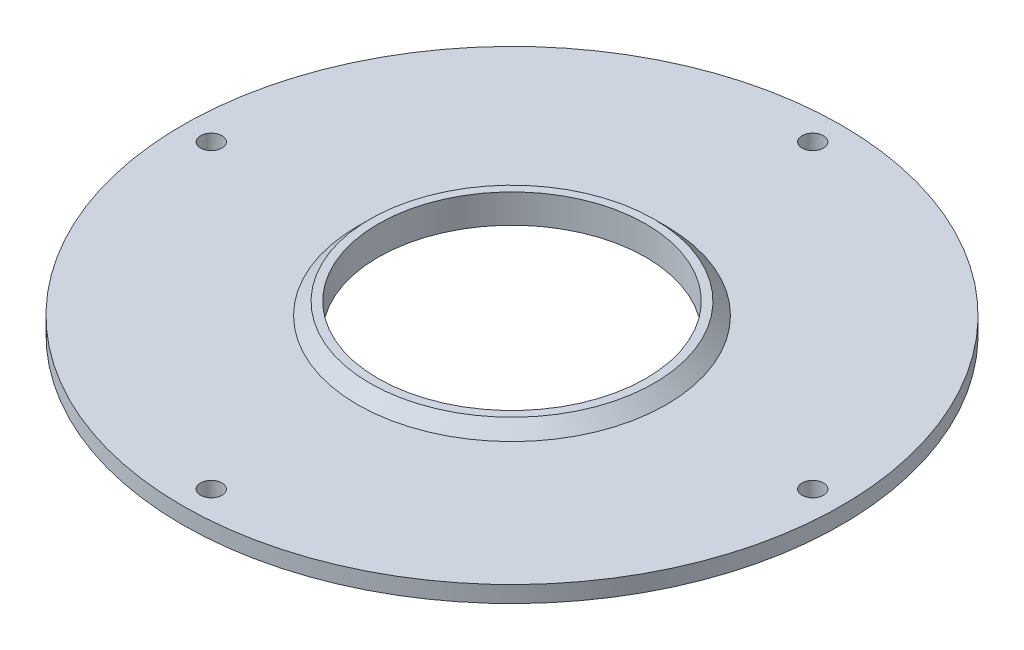
ISO-10303-21;
HEADER;
FILE_DESCRIPTION(('STEP AP214'),'2;1');
FILE_NAME('part.step','',(''),(''),'','','');
FILE_SCHEMA(('AUTOMOTIVE_DESIGN { 1 0 10303 214 1 1 1 1 }'));
ENDSEC;
DATA;
#1=APPLICATION_CONTEXT('core data for automotive mechanical design processes');
#2=APPLICATION_PROTOCOL_DEFINITION('international standard','automotive_design',2000,#1);
#3=PRODUCT_CONTEXT('',#1,'mechanical');
#4=PRODUCT('Part','Part','',(#3));
#5=PRODUCT_RELATED_PRODUCT_CATEGORY('part','',(#4));
#6=PRODUCT_DEFINITION_FORMATION('','',#4);
#7=PRODUCT_DEFINITION_CONTEXT('part definition',#1,'design');
#8=PRODUCT_DEFINITION('design','',#6,#7);
#9=PRODUCT_DEFINITION_SHAPE('','',#8);
#10=(LENGTH_UNIT() NAMED_UNIT(*) SI_UNIT(.MILLI.,.METRE.));
#11=(NAMED_UNIT(*) PLANE_ANGLE_UNIT() SI_UNIT($,.RADIAN.));
#12=(NAMED_UNIT(*) SI_UNIT($,.STERADIAN.) SOLID_ANGLE_UNIT());
#13=UNCERTAINTY_MEASURE_WITH_UNIT(LENGTH_MEASURE(1.E-05),#10,'distance_accuracy_value','');
#14=(GEOMETRIC_REPRESENTATION_CONTEXT(3) GLOBAL_UNCERTAINTY_ASSIGNED_CONTEXT((#13)) GLOBAL_UNIT_ASSIGNED_CONTEXT((#10,
#11,#12)) REPRESENTATION_CONTEXT('',''));
#15=CARTESIAN_POINT('',(0.,0.,0.));
#16=DIRECTION('',(0.,0.,1.));
#17=DIRECTION('',(1.,0.,0.));
#18=AXIS2_PLACEMENT_3D('',#15,#16,#17);
#19=CARTESIAN_POINT('',(0.,4.,0.));
#20=DIRECTION('',(0.,1.,0.));
#21=DIRECTION('',(0.,0.,1.));
#22=AXIS2_PLACEMENT_3D('',#19,#20,#21);
#23=PLANE('',#22);
#24=CARTESIAN_POINT('',(0.,4.,0.));
#25=DIRECTION('',(0.,1.,0.));
#26=DIRECTION('',(0.,0.,1.));
#27=AXIS2_PLACEMENT_3D('',#24,#25,#26);
#28=CIRCLE('',#27,37.5);
#29=CARTESIAN_POINT('',(0.,4.,37.5));
#30=VERTEX_POINT('',#29);
#31=EDGE_CURVE('E10',#30,#30,#28,.F.);
#32=ORIENTED_EDGE('',*,*,#31,.T.);
#33=EDGE_LOOP('',(#32));
#34=FACE_BOUND('',#33,.T.);
#35=CARTESIAN_POINT('',(0.,4.,0.));
#36=DIRECTION('',(0.,1.,0.));
#37=DIRECTION('',(0.,0.,1.));
#38=AXIS2_PLACEMENT_3D('',#35,#36,#37);
#39=CIRCLE('',#38,80.);
#40=CARTESIAN_POINT('',(0.,4.,80.));
#41=VERTEX_POINT('',#40);
#42=EDGE_CURVE('E52',#41,#41,#39,.T.);
#43=ORIENTED_EDGE('',*,*,#42,.T.);
#44=EDGE_LOOP('',(#43));
#45=FACE_BOUND('',#44,.T.);
#46=CARTESIAN_POINT('',(-73.,4.,-7.64634413206646E-13));
#47=DIRECTION('',(0.,1.,0.));
#48=DIRECTION('',(0.,0.,1.));
#49=AXIS2_PLACEMENT_3D('',#46,#47,#48);
#50=CIRCLE('',#49,2.60000000000001);
#51=CARTESIAN_POINT('',(-73.,4.,2.59999999999924));
#52=VERTEX_POINT('',#51);
#53=EDGE_CURVE('E73',#52,#52,#50,.T.);
#54=ORIENTED_EDGE('',*,*,#53,.F.);
#55=EDGE_LOOP('',(#54));
#56=FACE_BOUND('',#55,.T.);
#57=CARTESIAN_POINT('',(-5.09756275471097E-13,4.,73.));
#58=DIRECTION('',(0.,1.,0.));
#59=DIRECTION('',(0.,0.,1.));
#60=AXIS2_PLACEMENT_3D('',#57,#58,#59);
#61=CIRCLE('',#60,2.60000000000001);
#62=CARTESIAN_POINT('',(-5.09756275471097E-13,4.,75.6));
#63=VERTEX_POINT('',#62);
#64=EDGE_CURVE('E82',#63,#63,#61,.T.);
#65=ORIENTED_EDGE('',*,*,#64,.F.);
#66=EDGE_LOOP('',(#65));
#67=FACE_BOUND('',#66,.T.);
#68=CARTESIAN_POINT('',(73.,4.,2.54878137735549E-13));
#69=DIRECTION('',(0.,1.,0.));
#70=DIRECTION('',(0.,0.,1.));
#71=AXIS2_PLACEMENT_3D('',#68,#69,#70);
#72=CIRCLE('',#71,2.60000000000001);
#73=CARTESIAN_POINT('',(73.,4.,2.60000000000026));
#74=VERTEX_POINT('',#73);
#75=EDGE_CURVE('E90',#74,#74,#72,.T.);
#76=ORIENTED_EDGE('',*,*,#75,.F.);
#77=EDGE_LOOP('',(#76));
#78=FACE_BOUND('',#77,.T.);
#79=CARTESIAN_POINT('',(0.,4.,-73.));
#80=DIRECTION('',(0.,1.,0.));
#81=DIRECTION('',(0.,0.,1.));
#82=AXIS2_PLACEMENT_3D('',#79,#80,#81);
#83=CIRCLE('',#82,2.60000000000001);
#84=CARTESIAN_POINT('',(0.,4.,-70.4));
#85=VERTEX_POINT('',#84);
#86=EDGE_CURVE('E94',#85,#85,#83,.T.);
#87=ORIENTED_EDGE('',*,*,#86,.F.);
#88=EDGE_LOOP('',(#87));
#89=FACE_BOUND('',#88,.T.);
#90=ADVANCED_FACE('F43',(#34,#45,#56,#67,#78,#89),#23,.T.);
#91=CARTESIAN_POINT('',(0.,0.,0.));
#92=DIRECTION('',(0.,1.,0.));
#93=DIRECTION('',(0.,0.,1.));
#94=AXIS2_PLACEMENT_3D('',#91,#92,#93);
#95=PLANE('',#94);
#96=CARTESIAN_POINT('',(0.,0.,-73.));
#97=DIRECTION('',(0.,1.,0.));
#98=DIRECTION('',(0.,0.,1.));
#99=AXIS2_PLACEMENT_3D('',#96,#97,#98);
#100=CIRCLE('',#99,2.60000000000001);
#101=CARTESIAN_POINT('',(0.,0.,-70.4));
#102=VERTEX_POINT('',#101);
#103=EDGE_CURVE('E68',#102,#102,#100,.T.);
#104=ORIENTED_EDGE('',*,*,#103,.T.);
#105=EDGE_LOOP('',(#104));
#106=FACE_BOUND('',#105,.T.);
#107=CARTESIAN_POINT('',(73.,0.,2.54878137735549E-13));
#108=DIRECTION('',(0.,1.,0.));
#109=DIRECTION('',(0.,0.,1.));
#110=AXIS2_PLACEMENT_3D('',#107,#108,#109);
#111=CIRCLE('',#110,2.60000000000001);
#112=CARTESIAN_POINT('',(73.,0.,2.60000000000026));
#113=VERTEX_POINT('',#112);
#114=EDGE_CURVE('E86',#113,#113,#111,.T.);
#115=ORIENTED_EDGE('',*,*,#114,.T.);
#116=EDGE_LOOP('',(#115));
#117=FACE_BOUND('',#116,.T.);
#118=CARTESIAN_POINT('',(-5.09756275471097E-13,0.,73.));
#119=DIRECTION('',(0.,1.,0.));
#120=DIRECTION('',(0.,0.,1.));
#121=AXIS2_PLACEMENT_3D('',#118,#119,#120);
#122=CIRCLE('',#121,2.60000000000001);
#123=CARTESIAN_POINT('',(-5.09756275471097E-13,0.,75.6));
#124=VERTEX_POINT('',#123);
#125=EDGE_CURVE('E78',#124,#124,#122,.T.);
#126=ORIENTED_EDGE('',*,*,#125,.T.);
#127=EDGE_LOOP('',(#126));
#128=FACE_BOUND('',#127,.T.);
#129=CARTESIAN_POINT('',(-73.,0.,-7.64634413206646E-13));
#130=DIRECTION('',(0.,1.,0.));
#131=DIRECTION('',(0.,0.,1.));
#132=AXIS2_PLACEMENT_3D('',#129,#130,#131);
#133=CIRCLE('',#132,2.60000000000001);
#134=CARTESIAN_POINT('',(-73.,0.,2.59999999999924));
#135=VERTEX_POINT('',#134);
#136=EDGE_CURVE('E69',#135,#135,#133,.T.);
#137=ORIENTED_EDGE('',*,*,#136,.T.);
#138=EDGE_LOOP('',(#137));
#139=FACE_BOUND('',#138,.T.);
#140=CARTESIAN_POINT('',(0.,0.,0.));
#141=DIRECTION('',(0.,1.,0.));
#142=DIRECTION('',(0.,0.,1.));
#143=AXIS2_PLACEMENT_3D('',#140,#141,#142);
#144=CIRCLE('',#143,80.);
#145=CARTESIAN_POINT('',(0.,0.,80.));
#146=VERTEX_POINT('',#145);
#147=EDGE_CURVE('E57',#146,#146,#144,.T.);
#148=ORIENTED_EDGE('',*,*,#147,.F.);
#149=EDGE_LOOP('',(#148));
#150=FACE_BOUND('',#149,.T.);
#151=CARTESIAN_POINT('',(0.,0.,0.));
#152=DIRECTION('',(0.,1.,0.));
#153=DIRECTION('',(0.,0.,1.));
#154=AXIS2_PLACEMENT_3D('',#151,#152,#153);
#155=CIRCLE('',#154,32.5);
#156=CARTESIAN_POINT('',(0.,0.,32.5));
#157=VERTEX_POINT('',#156);
#158=EDGE_CURVE('E63',#157,#157,#155,.T.);
#159=ORIENTED_EDGE('',*,*,#158,.T.);
#160=EDGE_LOOP('',(#159));
#161=FACE_BOUND('',#160,.T.);
#162=ADVANCED_FACE('F126',(#106,#117,#128,#139,#150,#161),#95,.F.);
#163=CARTESIAN_POINT('',(0.,4.,0.));
#164=DIRECTION('',(0.,-1.,0.));
#165=DIRECTION('',(0.,0.,-1.));
#166=AXIS2_PLACEMENT_3D('',#163,#164,#165);
#167=CYLINDRICAL_SURFACE('',#166,80.);
#168=ORIENTED_EDGE('',*,*,#42,.F.);
#169=EDGE_LOOP('',(#168));
#170=FACE_BOUND('',#169,.T.);
#171=ORIENTED_EDGE('',*,*,#147,.T.);
#172=EDGE_LOOP('',(#171));
#173=FACE_BOUND('',#172,.T.);
#174=ADVANCED_FACE('F132',(#170,#173),#167,.T.);
#175=CARTESIAN_POINT('',(0.,4.,0.));
#176=DIRECTION('',(0.,-1.,0.));
#177=DIRECTION('',(0.,0.,-1.));
#178=AXIS2_PLACEMENT_3D('',#175,#176,#177);
#179=CYLINDRICAL_SURFACE('',#178,32.5);
#180=ORIENTED_EDGE('',*,*,#158,.F.);
#181=EDGE_LOOP('',(#180));
#182=FACE_BOUND('',#181,.T.);
#183=CARTESIAN_POINT('',(0.,7.,0.));
#184=DIRECTION('',(0.,1.,0.));
#185=DIRECTION('',(0.,0.,1.));
#186=AXIS2_PLACEMENT_3D('',#183,#184,#185);
#187=CIRCLE('',#186,32.5);
#188=CARTESIAN_POINT('',(0.,7.,32.5));
#189=VERTEX_POINT('',#188);
#190=EDGE_CURVE('E104',#189,#189,#187,.T.);
#191=ORIENTED_EDGE('',*,*,#190,.T.);
#192=EDGE_LOOP('',(#191));
#193=FACE_BOUND('',#192,.T.);
#194=ADVANCED_FACE('F109',(#182,#193),#179,.F.);
#195=CARTESIAN_POINT('',(-73.,0.,-7.64634413206646E-13));
#196=DIRECTION('',(0.,1.,0.));
#197=DIRECTION('',(0.,0.,1.));
#198=AXIS2_PLACEMENT_3D('',#195,#196,#197);
#199=CYLINDRICAL_SURFACE('',#198,2.60000000000001);
#200=ORIENTED_EDGE('',*,*,#136,.F.);
#201=EDGE_LOOP('',(#200));
#202=FACE_BOUND('',#201,.T.);
#203=ORIENTED_EDGE('',*,*,#53,.T.);
#204=EDGE_LOOP('',(#203));
#205=FACE_BOUND('',#204,.T.);
#206=ADVANCED_FACE('F142',(#202,#205),#199,.F.);
#207=CARTESIAN_POINT('',(-5.09756275471097E-13,0.,73.));
#208=DIRECTION('',(0.,1.,0.));
#209=DIRECTION('',(0.,0.,1.));
#210=AXIS2_PLACEMENT_3D('',#207,#208,#209);
#211=CYLINDRICAL_SURFACE('',#210,2.60000000000001);
#212=ORIENTED_EDGE('',*,*,#125,.F.);
#213=EDGE_LOOP('',(#212));
#214=FACE_BOUND('',#213,.T.);
#215=ORIENTED_EDGE('',*,*,#64,.T.);
#216=EDGE_LOOP('',(#215));
#217=FACE_BOUND('',#216,.T.);
#218=ADVANCED_FACE('F152',(#214,#217),#211,.F.);
#219=CARTESIAN_POINT('',(73.,0.,2.54878137735549E-13));
#220=DIRECTION('',(0.,1.,0.));
#221=DIRECTION('',(0.,0.,1.));
#222=AXIS2_PLACEMENT_3D('',#219,#220,#221);
#223=CYLINDRICAL_SURFACE('',#222,2.60000000000001);
#224=ORIENTED_EDGE('',*,*,#114,.F.);
#225=EDGE_LOOP('',(#224));
#226=FACE_BOUND('',#225,.T.);
#227=ORIENTED_EDGE('',*,*,#75,.T.);
#228=EDGE_LOOP('',(#227));
#229=FACE_BOUND('',#228,.T.);
#230=ADVANCED_FACE('F122',(#226,#229),#223,.F.);
#231=CARTESIAN_POINT('',(0.,0.,-73.));
#232=DIRECTION('',(0.,1.,0.));
#233=DIRECTION('',(0.,0.,1.));
#234=AXIS2_PLACEMENT_3D('',#231,#232,#233);
#235=CYLINDRICAL_SURFACE('',#234,2.60000000000001);
#236=ORIENTED_EDGE('',*,*,#103,.F.);
#237=EDGE_LOOP('',(#236));
#238=FACE_BOUND('',#237,.T.);
#239=ORIENTED_EDGE('',*,*,#86,.T.);
#240=EDGE_LOOP('',(#239));
#241=FACE_BOUND('',#240,.T.);
#242=ADVANCED_FACE('F113',(#238,#241),#235,.F.);
#243=CARTESIAN_POINT('',(0.,7.,0.));
#244=DIRECTION('',(0.,1.,0.));
#245=DIRECTION('',(0.,0.,1.));
#246=AXIS2_PLACEMENT_3D('',#243,#244,#245);
#247=PLANE('',#246);
#248=CARTESIAN_POINT('',(0.,7.,0.));
#249=DIRECTION('',(0.,1.,0.));
#250=DIRECTION('',(0.,0.,1.));
#251=AXIS2_PLACEMENT_3D('',#248,#249,#250);
#252=CIRCLE('',#251,34.5);
#253=CARTESIAN_POINT('',(0.,7.,34.5));
#254=VERTEX_POINT('',#253);
#255=EDGE_CURVE('E74',#254,#254,#252,.T.);
#256=ORIENTED_EDGE('',*,*,#255,.T.);
#257=EDGE_LOOP('',(#256));
#258=FACE_BOUND('',#257,.T.);
#259=ORIENTED_EDGE('',*,*,#190,.F.);
#260=EDGE_LOOP('',(#259));
#261=FACE_BOUND('',#260,.T.);
#262=ADVANCED_FACE('F111',(#258,#261),#247,.T.);
#263=CARTESIAN_POINT('',(0.,7.00000000000004,0.));
#264=DIRECTION('',(0.,-1.,0.));
#265=DIRECTION('',(0.,0.,-1.));
#266=AXIS2_PLACEMENT_3D('',#263,#264,#265);
#267=CONICAL_SURFACE('',#266,34.5,0.785398163397443);
#268=ORIENTED_EDGE('',*,*,#31,.F.);
#269=EDGE_LOOP('',(#268));
#270=FACE_BOUND('',#269,.T.);
#271=ORIENTED_EDGE('',*,*,#255,.F.);
#272=EDGE_LOOP('',(#271));
#273=FACE_BOUND('',#272,.T.);
#274=ADVANCED_FACE('F46',(#270,#273),#267,.T.);
#275=CLOSED_SHELL('',(#90,#162,#174,#194,#206,#218,#230,#242,#262,#274));
#276=MANIFOLD_SOLID_BREP('B2',#275);
#277=ADVANCED_BREP_SHAPE_REPRESENTATION('',(#18,#276),#14);
#278=SHAPE_DEFINITION_REPRESENTATION(#9,#277);
ENDSEC;
END-ISO-10303-21;
